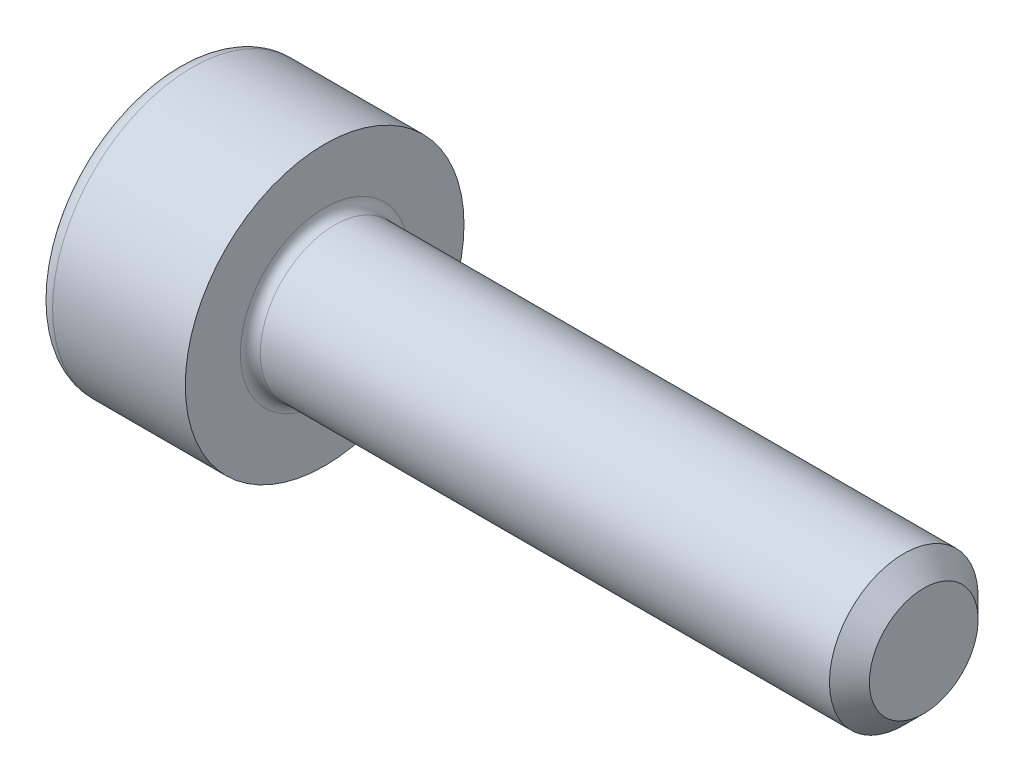
ISO-10303-21;
HEADER;
FILE_DESCRIPTION(('STEP AP214'),'2;1');
FILE_NAME('part.step','',(''),(''),'','','');
FILE_SCHEMA(('AUTOMOTIVE_DESIGN { 1 0 10303 214 1 1 1 1 }'));
ENDSEC;
DATA;
#1=APPLICATION_CONTEXT('core data for automotive mechanical design processes');
#2=APPLICATION_PROTOCOL_DEFINITION('international standard','automotive_design',2000,#1);
#3=PRODUCT_CONTEXT('',#1,'mechanical');
#4=PRODUCT('Part','Part','',(#3));
#5=PRODUCT_RELATED_PRODUCT_CATEGORY('part','',(#4));
#6=PRODUCT_DEFINITION_FORMATION('','',#4);
#7=PRODUCT_DEFINITION_CONTEXT('part definition',#1,'design');
#8=PRODUCT_DEFINITION('design','',#6,#7);
#9=PRODUCT_DEFINITION_SHAPE('','',#8);
#10=(LENGTH_UNIT() NAMED_UNIT(*) SI_UNIT(.MILLI.,.METRE.));
#11=(NAMED_UNIT(*) PLANE_ANGLE_UNIT() SI_UNIT($,.RADIAN.));
#12=(NAMED_UNIT(*) SI_UNIT($,.STERADIAN.) SOLID_ANGLE_UNIT());
#13=UNCERTAINTY_MEASURE_WITH_UNIT(LENGTH_MEASURE(1.E-05),#10,'distance_accuracy_value','');
#14=(GEOMETRIC_REPRESENTATION_CONTEXT(3) GLOBAL_UNCERTAINTY_ASSIGNED_CONTEXT((#13)) GLOBAL_UNIT_ASSIGNED_CONTEXT((#10,
#11,#12)) REPRESENTATION_CONTEXT('',''));
#15=CARTESIAN_POINT('',(0.,0.,0.));
#16=DIRECTION('',(0.,0.,1.));
#17=DIRECTION('',(1.,0.,0.));
#18=AXIS2_PLACEMENT_3D('',#15,#16,#17);
#19=CARTESIAN_POINT('',(0.,0.,0.));
#20=DIRECTION('',(-1.,0.,0.));
#21=DIRECTION('',(0.,0.,1.));
#22=AXIS2_PLACEMENT_3D('',#19,#20,#21);
#23=CYLINDRICAL_SURFACE('',#22,1.39568824458778);
#24=CARTESIAN_POINT('',(0.16,0.,0.));
#25=DIRECTION('',(1.,0.,0.));
#26=DIRECTION('',(0.,0.,-1.));
#27=AXIS2_PLACEMENT_3D('',#24,#25,#26);
#28=CIRCLE('',#27,1.39568824458778);
#29=CARTESIAN_POINT('',(0.16,0.,-1.39568824458778));
#30=VERTEX_POINT('',#29);
#31=EDGE_CURVE('E158',#30,#30,#28,.T.);
#32=ORIENTED_EDGE('',*,*,#31,.T.);
#33=EDGE_LOOP('',(#32));
#34=FACE_BOUND('',#33,.T.);
#35=CARTESIAN_POINT('',(1.48873412756029,0.,0.));
#36=DIRECTION('',(-1.,0.,0.));
#37=DIRECTION('',(0.,0.,1.));
#38=AXIS2_PLACEMENT_3D('',#35,#36,#37);
#39=CIRCLE('',#38,1.39568824458778);
#40=CARTESIAN_POINT('',(1.48873412756029,0.,1.39568824458778));
#41=VERTEX_POINT('',#40);
#42=EDGE_CURVE('E141',#41,#41,#39,.T.);
#43=ORIENTED_EDGE('',*,*,#42,.T.);
#44=EDGE_LOOP('',(#43));
#45=FACE_BOUND('',#44,.T.);
#46=ADVANCED_FACE('F39',(#34,#45),#23,.T.);
#47=CARTESIAN_POINT('',(0.,0.,0.));
#48=DIRECTION('',(1.,0.,0.));
#49=DIRECTION('',(0.,0.,-1.));
#50=AXIS2_PLACEMENT_3D('',#47,#48,#49);
#51=PLANE('',#50);
#52=DIRECTION('',(0.,-0.5,-0.866025403784439));
#53=VECTOR('',#52,1.);
#54=CARTESIAN_POINT('',(0.,0.877572409168232,0.));
#55=LINE('',#54,#53);
#56=CARTESIAN_POINT('',(0.,0.877572409168232,0.));
#57=VERTEX_POINT('',#56);
#58=CARTESIAN_POINT('',(0.,0.438786204584116,-0.760000000000001));
#59=VERTEX_POINT('',#58);
#60=EDGE_CURVE('E128',#57,#59,#55,.T.);
#61=ORIENTED_EDGE('',*,*,#60,.F.);
#62=DIRECTION('',(0.,0.5,-0.866025403784439));
#63=VECTOR('',#62,1.);
#64=CARTESIAN_POINT('',(0.,0.438786204584116,0.76));
#65=LINE('',#64,#63);
#66=CARTESIAN_POINT('',(0.,0.438786204584116,0.76));
#67=VERTEX_POINT('',#66);
#68=EDGE_CURVE('E54',#67,#57,#65,.T.);
#69=ORIENTED_EDGE('',*,*,#68,.F.);
#70=DIRECTION('',(0.,1.,0.));
#71=VECTOR('',#70,1.);
#72=CARTESIAN_POINT('',(0.,-0.438786204584116,0.76));
#73=LINE('',#72,#71);
#74=CARTESIAN_POINT('',(0.,-0.438786204584116,0.76));
#75=VERTEX_POINT('',#74);
#76=EDGE_CURVE('E137',#75,#67,#73,.T.);
#77=ORIENTED_EDGE('',*,*,#76,.F.);
#78=DIRECTION('',(0.,0.5,0.866025403784439));
#79=VECTOR('',#78,1.);
#80=CARTESIAN_POINT('',(0.,-0.877572409168232,0.));
#81=LINE('',#80,#79);
#82=CARTESIAN_POINT('',(0.,-0.877572409168232,0.));
#83=VERTEX_POINT('',#82);
#84=EDGE_CURVE('E135',#83,#75,#81,.T.);
#85=ORIENTED_EDGE('',*,*,#84,.F.);
#86=DIRECTION('',(0.,-0.5,0.866025403784438));
#87=VECTOR('',#86,1.);
#88=CARTESIAN_POINT('',(0.,-0.438786204584116,-0.760000000000001));
#89=LINE('',#88,#87);
#90=CARTESIAN_POINT('',(0.,-0.438786204584116,-0.760000000000001));
#91=VERTEX_POINT('',#90);
#92=EDGE_CURVE('E102',#91,#83,#89,.T.);
#93=ORIENTED_EDGE('',*,*,#92,.F.);
#94=DIRECTION('',(0.,-1.,0.));
#95=VECTOR('',#94,1.);
#96=CARTESIAN_POINT('',(0.,0.438786204584116,-0.760000000000001));
#97=LINE('',#96,#95);
#98=EDGE_CURVE('E131',#59,#91,#97,.T.);
#99=ORIENTED_EDGE('',*,*,#98,.F.);
#100=EDGE_LOOP('',(#61,#69,#77,#85,#93,#99));
#101=FACE_BOUND('',#100,.T.);
#102=CARTESIAN_POINT('',(0.,0.,0.));
#103=DIRECTION('',(1.,0.,0.));
#104=DIRECTION('',(0.,0.,-1.));
#105=AXIS2_PLACEMENT_3D('',#102,#103,#104);
#106=CIRCLE('',#105,1.23568824458778);
#107=CARTESIAN_POINT('',(0.,0.,-1.23568824458778));
#108=VERTEX_POINT('',#107);
#109=EDGE_CURVE('E155',#108,#108,#106,.F.);
#110=ORIENTED_EDGE('',*,*,#109,.T.);
#111=EDGE_LOOP('',(#110));
#112=FACE_BOUND('',#111,.T.);
#113=ADVANCED_FACE('F180',(#101,#112),#51,.F.);
#114=CARTESIAN_POINT('',(7.48873412756029,0.,0.));
#115=DIRECTION('',(-1.,0.,0.));
#116=DIRECTION('',(0.,0.,1.));
#117=AXIS2_PLACEMENT_3D('',#114,#115,#116);
#118=PLANE('',#117);
#119=CARTESIAN_POINT('',(7.48873412756029,0.,0.));
#120=DIRECTION('',(-1.,0.,0.));
#121=DIRECTION('',(0.,0.,1.));
#122=AXIS2_PLACEMENT_3D('',#119,#120,#121);
#123=CIRCLE('',#122,0.544367063780146);
#124=CARTESIAN_POINT('',(7.48873412756029,0.,0.544367063780146));
#125=VERTEX_POINT('',#124);
#126=EDGE_CURVE('E11',#125,#125,#123,.F.);
#127=ORIENTED_EDGE('',*,*,#126,.T.);
#128=EDGE_LOOP('',(#127));
#129=FACE_BOUND('',#128,.T.);
#130=ADVANCED_FACE('F186',(#129),#118,.F.);
#131=CARTESIAN_POINT('',(0.,0.,0.));
#132=DIRECTION('',(-1.,0.,0.));
#133=DIRECTION('',(0.,0.,1.));
#134=AXIS2_PLACEMENT_3D('',#131,#132,#133);
#135=CYLINDRICAL_SURFACE('',#134,0.744367063780147);
#136=CARTESIAN_POINT('',(7.28873412756029,0.,0.));
#137=DIRECTION('',(-1.,0.,0.));
#138=DIRECTION('',(0.,0.,1.));
#139=AXIS2_PLACEMENT_3D('',#136,#137,#138);
#140=CIRCLE('',#139,0.744367063780147);
#141=CARTESIAN_POINT('',(7.28873412756029,0.,0.744367063780147));
#142=VERTEX_POINT('',#141);
#143=EDGE_CURVE('E47',#142,#142,#140,.T.);
#144=ORIENTED_EDGE('',*,*,#143,.T.);
#145=EDGE_LOOP('',(#144));
#146=FACE_BOUND('',#145,.T.);
#147=CARTESIAN_POINT('',(1.58873412756029,0.,0.));
#148=DIRECTION('',(-1.,0.,0.));
#149=DIRECTION('',(0.,0.,1.));
#150=AXIS2_PLACEMENT_3D('',#147,#148,#149);
#151=CIRCLE('',#150,0.744367063780147);
#152=CARTESIAN_POINT('',(1.58873412756029,0.,0.744367063780147));
#153=VERTEX_POINT('',#152);
#154=EDGE_CURVE('E152',#153,#153,#151,.F.);
#155=ORIENTED_EDGE('',*,*,#154,.T.);
#156=EDGE_LOOP('',(#155));
#157=FACE_BOUND('',#156,.T.);
#158=ADVANCED_FACE('F163',(#146,#157),#135,.T.);
#159=CARTESIAN_POINT('',(1.48873412756029,0.,0.));
#160=DIRECTION('',(-1.,0.,0.));
#161=DIRECTION('',(0.,0.,1.));
#162=AXIS2_PLACEMENT_3D('',#159,#160,#161);
#163=PLANE('',#162);
#164=CARTESIAN_POINT('',(1.48873412756029,0.,0.));
#165=DIRECTION('',(-1.,0.,0.));
#166=DIRECTION('',(0.,0.,1.));
#167=AXIS2_PLACEMENT_3D('',#164,#165,#166);
#168=CIRCLE('',#167,0.844367063780147);
#169=CARTESIAN_POINT('',(1.48873412756029,0.,0.844367063780147));
#170=VERTEX_POINT('',#169);
#171=EDGE_CURVE('E149',#170,#170,#168,.T.);
#172=ORIENTED_EDGE('',*,*,#171,.T.);
#173=EDGE_LOOP('',(#172));
#174=FACE_BOUND('',#173,.T.);
#175=ORIENTED_EDGE('',*,*,#42,.F.);
#176=EDGE_LOOP('',(#175));
#177=FACE_BOUND('',#176,.T.);
#178=ADVANCED_FACE('F193',(#174,#177),#163,.F.);
#179=CARTESIAN_POINT('',(1.58873412756029,0.,0.));
#180=DIRECTION('',(-1.,0.,0.));
#181=DIRECTION('',(0.,0.,1.));
#182=AXIS2_PLACEMENT_3D('',#179,#180,#181);
#183=TOROIDAL_SURFACE('',#182,0.844367063780147,0.1);
#184=ORIENTED_EDGE('',*,*,#154,.F.);
#185=EDGE_LOOP('',(#184));
#186=FACE_BOUND('',#185,.T.);
#187=ORIENTED_EDGE('',*,*,#171,.F.);
#188=EDGE_LOOP('',(#187));
#189=FACE_BOUND('',#188,.T.);
#190=ADVANCED_FACE('F176',(#186,#189),#183,.F.);
#191=CARTESIAN_POINT('',(0.16,0.,0.));
#192=DIRECTION('',(1.,0.,0.));
#193=DIRECTION('',(0.,0.,-1.));
#194=AXIS2_PLACEMENT_3D('',#191,#192,#193);
#195=TOROIDAL_SURFACE('',#194,1.23568824458778,0.16);
#196=ORIENTED_EDGE('',*,*,#31,.F.);
#197=EDGE_LOOP('',(#196));
#198=FACE_BOUND('',#197,.T.);
#199=ORIENTED_EDGE('',*,*,#109,.F.);
#200=EDGE_LOOP('',(#199));
#201=FACE_BOUND('',#200,.T.);
#202=ADVANCED_FACE('F168',(#198,#201),#195,.T.);
#203=CARTESIAN_POINT('',(7.28873412756029,0.,0.));
#204=DIRECTION('',(-1.,0.,0.));
#205=DIRECTION('',(0.,0.,1.));
#206=AXIS2_PLACEMENT_3D('',#203,#204,#205);
#207=CONICAL_SURFACE('',#206,0.744367063780147,0.785398163397449);
#208=ORIENTED_EDGE('',*,*,#126,.F.);
#209=EDGE_LOOP('',(#208));
#210=FACE_BOUND('',#209,.T.);
#211=ORIENTED_EDGE('',*,*,#143,.F.);
#212=EDGE_LOOP('',(#211));
#213=FACE_BOUND('',#212,.T.);
#214=ADVANCED_FACE('F41',(#210,#213),#207,.T.);
#215=CARTESIAN_POINT('',(0.7,0.438786204584116,0.76));
#216=DIRECTION('',(0.,0.866025403784439,0.5));
#217=DIRECTION('',(0.,-0.5,0.866025403784439));
#218=AXIS2_PLACEMENT_3D('',#215,#216,#217);
#219=PLANE('',#218);
#220=ORIENTED_EDGE('',*,*,#68,.T.);
#221=DIRECTION('',(-1.,0.,0.));
#222=VECTOR('',#221,1.);
#223=CARTESIAN_POINT('',(0.7,0.877572409168232,0.));
#224=LINE('',#223,#222);
#225=CARTESIAN_POINT('',(0.7,0.877572409168232,0.));
#226=VERTEX_POINT('',#225);
#227=EDGE_CURVE('E84',#226,#57,#224,.T.);
#228=ORIENTED_EDGE('',*,*,#227,.F.);
#229=DIRECTION('',(0.,0.5,-0.866025403784439));
#230=VECTOR('',#229,1.);
#231=CARTESIAN_POINT('',(0.7,0.438786204584116,0.76));
#232=LINE('',#231,#230);
#233=CARTESIAN_POINT('',(0.7,0.438786204584116,0.76));
#234=VERTEX_POINT('',#233);
#235=EDGE_CURVE('E139',#234,#226,#232,.T.);
#236=ORIENTED_EDGE('',*,*,#235,.F.);
#237=DIRECTION('',(-1.,0.,0.));
#238=VECTOR('',#237,1.);
#239=CARTESIAN_POINT('',(0.7,0.438786204584116,0.76));
#240=LINE('',#239,#238);
#241=EDGE_CURVE('E62',#234,#67,#240,.T.);
#242=ORIENTED_EDGE('',*,*,#241,.T.);
#243=EDGE_LOOP('',(#220,#228,#236,#242));
#244=FACE_BOUND('',#243,.T.);
#245=ADVANCED_FACE('F167',(#244),#219,.F.);
#246=CARTESIAN_POINT('',(0.7,-0.438786204584116,0.76));
#247=DIRECTION('',(0.,0.,1.));
#248=DIRECTION('',(1.,0.,0.));
#249=AXIS2_PLACEMENT_3D('',#246,#247,#248);
#250=PLANE('',#249);
#251=ORIENTED_EDGE('',*,*,#76,.T.);
#252=ORIENTED_EDGE('',*,*,#241,.F.);
#253=DIRECTION('',(0.,1.,0.));
#254=VECTOR('',#253,1.);
#255=CARTESIAN_POINT('',(0.7,-0.438786204584116,0.76));
#256=LINE('',#255,#254);
#257=CARTESIAN_POINT('',(0.7,-0.438786204584116,0.76));
#258=VERTEX_POINT('',#257);
#259=EDGE_CURVE('E114',#258,#234,#256,.T.);
#260=ORIENTED_EDGE('',*,*,#259,.F.);
#261=DIRECTION('',(-1.,0.,0.));
#262=VECTOR('',#261,1.);
#263=CARTESIAN_POINT('',(0.7,-0.438786204584116,0.76));
#264=LINE('',#263,#262);
#265=EDGE_CURVE('E106',#258,#75,#264,.T.);
#266=ORIENTED_EDGE('',*,*,#265,.T.);
#267=EDGE_LOOP('',(#251,#252,#260,#266));
#268=FACE_BOUND('',#267,.T.);
#269=ADVANCED_FACE('F174',(#268),#250,.F.);
#270=CARTESIAN_POINT('',(0.7,-0.877572409168232,0.));
#271=DIRECTION('',(0.,-0.866025403784439,0.5));
#272=DIRECTION('',(0.,-0.5,-0.866025403784439));
#273=AXIS2_PLACEMENT_3D('',#270,#271,#272);
#274=PLANE('',#273);
#275=ORIENTED_EDGE('',*,*,#84,.T.);
#276=ORIENTED_EDGE('',*,*,#265,.F.);
#277=DIRECTION('',(0.,0.5,0.866025403784439));
#278=VECTOR('',#277,1.);
#279=CARTESIAN_POINT('',(0.7,-0.877572409168232,0.));
#280=LINE('',#279,#278);
#281=CARTESIAN_POINT('',(0.7,-0.877572409168232,0.));
#282=VERTEX_POINT('',#281);
#283=EDGE_CURVE('E110',#282,#258,#280,.T.);
#284=ORIENTED_EDGE('',*,*,#283,.F.);
#285=DIRECTION('',(-1.,0.,0.));
#286=VECTOR('',#285,1.);
#287=CARTESIAN_POINT('',(0.7,-0.877572409168232,0.));
#288=LINE('',#287,#286);
#289=EDGE_CURVE('E95',#282,#83,#288,.T.);
#290=ORIENTED_EDGE('',*,*,#289,.T.);
#291=EDGE_LOOP('',(#275,#276,#284,#290));
#292=FACE_BOUND('',#291,.T.);
#293=ADVANCED_FACE('F111',(#292),#274,.F.);
#294=CARTESIAN_POINT('',(0.7,-0.438786204584116,-0.760000000000001));
#295=DIRECTION('',(0.,-0.866025403784438,-0.5));
#296=DIRECTION('',(0.,0.5,-0.866025403784438));
#297=AXIS2_PLACEMENT_3D('',#294,#295,#296);
#298=PLANE('',#297);
#299=ORIENTED_EDGE('',*,*,#92,.T.);
#300=ORIENTED_EDGE('',*,*,#289,.F.);
#301=DIRECTION('',(0.,-0.5,0.866025403784438));
#302=VECTOR('',#301,1.);
#303=CARTESIAN_POINT('',(0.7,-0.438786204584116,-0.760000000000001));
#304=LINE('',#303,#302);
#305=CARTESIAN_POINT('',(0.7,-0.438786204584116,-0.760000000000001));
#306=VERTEX_POINT('',#305);
#307=EDGE_CURVE('E99',#306,#282,#304,.T.);
#308=ORIENTED_EDGE('',*,*,#307,.F.);
#309=DIRECTION('',(-1.,0.,0.));
#310=VECTOR('',#309,1.);
#311=CARTESIAN_POINT('',(0.7,-0.438786204584116,-0.760000000000001));
#312=LINE('',#311,#310);
#313=EDGE_CURVE('E107',#306,#91,#312,.T.);
#314=ORIENTED_EDGE('',*,*,#313,.T.);
#315=EDGE_LOOP('',(#299,#300,#308,#314));
#316=FACE_BOUND('',#315,.T.);
#317=ADVANCED_FACE('F97',(#316),#298,.F.);
#318=CARTESIAN_POINT('',(0.7,0.438786204584116,-0.760000000000001));
#319=DIRECTION('',(0.,0.,-1.));
#320=DIRECTION('',(0.,1.,0.));
#321=AXIS2_PLACEMENT_3D('',#318,#319,#320);
#322=PLANE('',#321);
#323=ORIENTED_EDGE('',*,*,#98,.T.);
#324=ORIENTED_EDGE('',*,*,#313,.F.);
#325=DIRECTION('',(0.,-1.,0.));
#326=VECTOR('',#325,1.);
#327=CARTESIAN_POINT('',(0.7,0.438786204584116,-0.760000000000001));
#328=LINE('',#327,#326);
#329=CARTESIAN_POINT('',(0.7,0.438786204584116,-0.760000000000001));
#330=VERTEX_POINT('',#329);
#331=EDGE_CURVE('E120',#330,#306,#328,.T.);
#332=ORIENTED_EDGE('',*,*,#331,.F.);
#333=DIRECTION('',(-1.,0.,0.));
#334=VECTOR('',#333,1.);
#335=CARTESIAN_POINT('',(0.7,0.438786204584116,-0.760000000000001));
#336=LINE('',#335,#334);
#337=EDGE_CURVE('E144',#330,#59,#336,.T.);
#338=ORIENTED_EDGE('',*,*,#337,.T.);
#339=EDGE_LOOP('',(#323,#324,#332,#338));
#340=FACE_BOUND('',#339,.T.);
#341=ADVANCED_FACE('F215',(#340),#322,.F.);
#342=CARTESIAN_POINT('',(0.7,0.877572409168232,0.));
#343=DIRECTION('',(0.,0.866025403784439,-0.5));
#344=DIRECTION('',(0.,0.5,0.866025403784439));
#345=AXIS2_PLACEMENT_3D('',#342,#343,#344);
#346=PLANE('',#345);
#347=ORIENTED_EDGE('',*,*,#60,.T.);
#348=ORIENTED_EDGE('',*,*,#337,.F.);
#349=DIRECTION('',(0.,-0.5,-0.866025403784439));
#350=VECTOR('',#349,1.);
#351=CARTESIAN_POINT('',(0.7,0.877572409168232,0.));
#352=LINE('',#351,#350);
#353=EDGE_CURVE('E122',#226,#330,#352,.T.);
#354=ORIENTED_EDGE('',*,*,#353,.F.);
#355=ORIENTED_EDGE('',*,*,#227,.T.);
#356=EDGE_LOOP('',(#347,#348,#354,#355));
#357=FACE_BOUND('',#356,.T.);
#358=ADVANCED_FACE('F212',(#357),#346,.F.);
#359=CARTESIAN_POINT('',(0.7,0.,0.));
#360=DIRECTION('',(-1.,0.,0.));
#361=DIRECTION('',(0.,0.,1.));
#362=AXIS2_PLACEMENT_3D('',#359,#360,#361);
#363=PLANE('',#362);
#364=ORIENTED_EDGE('',*,*,#235,.T.);
#365=ORIENTED_EDGE('',*,*,#353,.T.);
#366=ORIENTED_EDGE('',*,*,#331,.T.);
#367=ORIENTED_EDGE('',*,*,#307,.T.);
#368=ORIENTED_EDGE('',*,*,#283,.T.);
#369=ORIENTED_EDGE('',*,*,#259,.T.);
#370=EDGE_LOOP('',(#364,#365,#366,#367,#368,#369));
#371=FACE_BOUND('',#370,.T.);
#372=ADVANCED_FACE('F117',(#371),#363,.T.);
#373=CLOSED_SHELL('',(#46,#113,#130,#158,#178,#190,#202,#214,#245,#269,#293,#317,#341,#358,#372));
#374=MANIFOLD_SOLID_BREP('B2',#373);
#375=ADVANCED_BREP_SHAPE_REPRESENTATION('',(#18,#374),#14);
#376=SHAPE_DEFINITION_REPRESENTATION(#9,#375);
ENDSEC;
END-ISO-10303-21;
